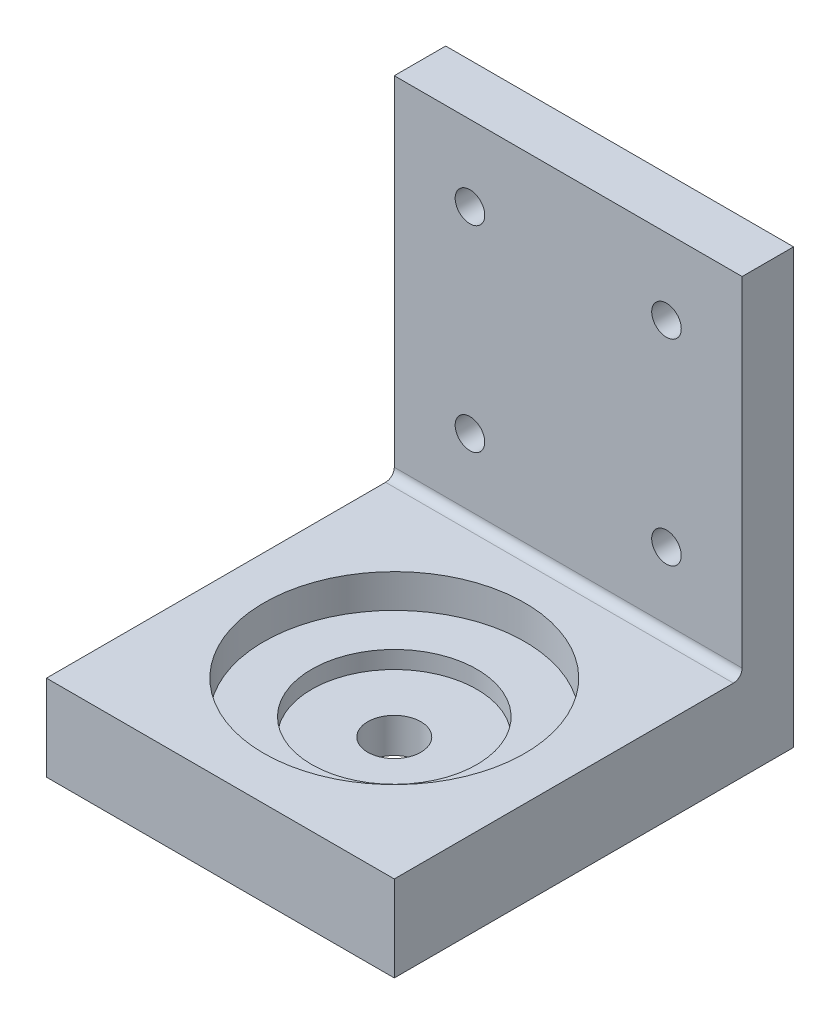
ISO-10303-21;
HEADER;
FILE_DESCRIPTION(('STEP AP214'),'2;1');
FILE_NAME('part.step','',(''),(''),'','','');
FILE_SCHEMA(('AUTOMOTIVE_DESIGN { 1 0 10303 214 1 1 1 1 }'));
ENDSEC;
DATA;
#1=APPLICATION_CONTEXT('core data for automotive mechanical design processes');
#2=APPLICATION_PROTOCOL_DEFINITION('international standard','automotive_design',2000,#1);
#3=PRODUCT_CONTEXT('',#1,'mechanical');
#4=PRODUCT('Part','Part','',(#3));
#5=PRODUCT_RELATED_PRODUCT_CATEGORY('part','',(#4));
#6=PRODUCT_DEFINITION_FORMATION('','',#4);
#7=PRODUCT_DEFINITION_CONTEXT('part definition',#1,'design');
#8=PRODUCT_DEFINITION('design','',#6,#7);
#9=PRODUCT_DEFINITION_SHAPE('','',#8);
#10=(LENGTH_UNIT() NAMED_UNIT(*) SI_UNIT(.MILLI.,.METRE.));
#11=(NAMED_UNIT(*) PLANE_ANGLE_UNIT() SI_UNIT($,.RADIAN.));
#12=(NAMED_UNIT(*) SI_UNIT($,.STERADIAN.) SOLID_ANGLE_UNIT());
#13=UNCERTAINTY_MEASURE_WITH_UNIT(LENGTH_MEASURE(1.E-05),#10,'distance_accuracy_value','');
#14=(GEOMETRIC_REPRESENTATION_CONTEXT(3) GLOBAL_UNCERTAINTY_ASSIGNED_CONTEXT((#13)) GLOBAL_UNIT_ASSIGNED_CONTEXT((#10,
#11,#12)) REPRESENTATION_CONTEXT('',''));
#15=CARTESIAN_POINT('',(0.,0.,0.));
#16=DIRECTION('',(0.,0.,1.));
#17=DIRECTION('',(1.,0.,0.));
#18=AXIS2_PLACEMENT_3D('',#15,#16,#17);
#19=CARTESIAN_POINT('',(0.,9.86484829732188,0.));
#20=DIRECTION('',(1.,0.,0.));
#21=DIRECTION('',(0.,0.,-1.));
#22=AXIS2_PLACEMENT_3D('',#19,#20,#21);
#23=PLANE('',#22);
#24=DIRECTION('',(0.,0.,1.));
#25=VECTOR('',#24,1.);
#26=CARTESIAN_POINT('',(0.,0.,0.));
#27=LINE('',#26,#25);
#28=CARTESIAN_POINT('',(0.,0.,-5.91350116383523));
#29=VERTEX_POINT('',#28);
#30=CARTESIAN_POINT('',(0.,0.,40.));
#31=VERTEX_POINT('',#30);
#32=EDGE_CURVE('E131',#29,#31,#27,.T.);
#33=ORIENTED_EDGE('',*,*,#32,.T.);
#34=DIRECTION('',(0.,-1.,0.));
#35=VECTOR('',#34,1.);
#36=CARTESIAN_POINT('',(0.,9.86484829732188,40.));
#37=LINE('',#36,#35);
#38=CARTESIAN_POINT('',(0.,9.86484829732188,40.));
#39=VERTEX_POINT('',#38);
#40=EDGE_CURVE('E152',#39,#31,#37,.T.);
#41=ORIENTED_EDGE('',*,*,#40,.F.);
#42=DIRECTION('',(0.,0.,1.));
#43=VECTOR('',#42,1.);
#44=CARTESIAN_POINT('',(0.,9.86484829732188,0.));
#45=LINE('',#44,#43);
#46=CARTESIAN_POINT('',(0.,9.86484829732188,1.));
#47=VERTEX_POINT('',#46);
#48=EDGE_CURVE('E139',#47,#39,#45,.T.);
#49=ORIENTED_EDGE('',*,*,#48,.F.);
#50=CARTESIAN_POINT('',(0.,10.8648482973219,1.));
#51=DIRECTION('',(1.,0.,0.));
#52=DIRECTION('',(0.,0.,-1.));
#53=AXIS2_PLACEMENT_3D('',#50,#51,#52);
#54=CIRCLE('',#53,1.);
#55=CARTESIAN_POINT('',(0.,10.8648482973219,0.));
#56=VERTEX_POINT('',#55);
#57=EDGE_CURVE('E50',#47,#56,#54,.T.);
#58=ORIENTED_EDGE('',*,*,#57,.T.);
#59=DIRECTION('',(0.,-1.,0.));
#60=VECTOR('',#59,1.);
#61=CARTESIAN_POINT('',(0.,49.86,0.));
#62=LINE('',#61,#60);
#63=CARTESIAN_POINT('',(0.,49.86,0.));
#64=VERTEX_POINT('',#63);
#65=EDGE_CURVE('E96',#64,#56,#62,.T.);
#66=ORIENTED_EDGE('',*,*,#65,.F.);
#67=DIRECTION('',(0.,0.,1.));
#68=VECTOR('',#67,1.);
#69=CARTESIAN_POINT('',(0.,49.86,0.));
#70=LINE('',#69,#68);
#71=CARTESIAN_POINT('',(0.,49.86,-5.91350116383523));
#72=VERTEX_POINT('',#71);
#73=EDGE_CURVE('E101',#72,#64,#70,.T.);
#74=ORIENTED_EDGE('',*,*,#73,.F.);
#75=DIRECTION('',(0.,-1.,0.));
#76=VECTOR('',#75,1.);
#77=CARTESIAN_POINT('',(0.,49.86,-5.91350116383523));
#78=LINE('',#77,#76);
#79=EDGE_CURVE('E269',#72,#29,#78,.T.);
#80=ORIENTED_EDGE('',*,*,#79,.T.);
#81=EDGE_LOOP('',(#33,#41,#49,#58,#66,#74,#80));
#82=FACE_BOUND('',#81,.T.);
#83=ADVANCED_FACE('F39',(#82),#23,.F.);
#84=CARTESIAN_POINT('',(0.,9.86484829732188,40.));
#85=DIRECTION('',(0.,0.,-1.));
#86=DIRECTION('',(-1.,0.,0.));
#87=AXIS2_PLACEMENT_3D('',#84,#85,#86);
#88=PLANE('',#87);
#89=DIRECTION('',(1.,0.,0.));
#90=VECTOR('',#89,1.);
#91=CARTESIAN_POINT('',(0.,0.,40.));
#92=LINE('',#91,#90);
#93=CARTESIAN_POINT('',(40.,0.,40.));
#94=VERTEX_POINT('',#93);
#95=EDGE_CURVE('E149',#31,#94,#92,.T.);
#96=ORIENTED_EDGE('',*,*,#95,.T.);
#97=DIRECTION('',(0.,-1.,0.));
#98=VECTOR('',#97,1.);
#99=CARTESIAN_POINT('',(40.,9.86484829732188,40.));
#100=LINE('',#99,#98);
#101=CARTESIAN_POINT('',(40.,9.86484829732188,40.));
#102=VERTEX_POINT('',#101);
#103=EDGE_CURVE('E147',#102,#94,#100,.T.);
#104=ORIENTED_EDGE('',*,*,#103,.F.);
#105=DIRECTION('',(1.,0.,0.));
#106=VECTOR('',#105,1.);
#107=CARTESIAN_POINT('',(0.,9.86484829732188,40.));
#108=LINE('',#107,#106);
#109=EDGE_CURVE('E138',#39,#102,#108,.T.);
#110=ORIENTED_EDGE('',*,*,#109,.F.);
#111=ORIENTED_EDGE('',*,*,#40,.T.);
#112=EDGE_LOOP('',(#96,#104,#110,#111));
#113=FACE_BOUND('',#112,.T.);
#114=ADVANCED_FACE('F166',(#113),#88,.F.);
#115=CARTESIAN_POINT('',(40.,9.86484829732188,0.));
#116=DIRECTION('',(-1.,0.,0.));
#117=DIRECTION('',(0.,0.,1.));
#118=AXIS2_PLACEMENT_3D('',#115,#116,#117);
#119=PLANE('',#118);
#120=DIRECTION('',(0.,0.,-1.));
#121=VECTOR('',#120,1.);
#122=CARTESIAN_POINT('',(40.,0.,0.));
#123=LINE('',#122,#121);
#124=CARTESIAN_POINT('',(40.,0.,-5.91350116383523));
#125=VERTEX_POINT('',#124);
#126=EDGE_CURVE('E142',#94,#125,#123,.T.);
#127=ORIENTED_EDGE('',*,*,#126,.T.);
#128=DIRECTION('',(0.,-1.,0.));
#129=VECTOR('',#128,1.);
#130=CARTESIAN_POINT('',(40.,49.86,-5.91350116383523));
#131=LINE('',#130,#129);
#132=CARTESIAN_POINT('',(40.,49.86,-5.91350116383523));
#133=VERTEX_POINT('',#132);
#134=EDGE_CURVE('E118',#133,#125,#131,.T.);
#135=ORIENTED_EDGE('',*,*,#134,.F.);
#136=DIRECTION('',(0.,0.,-1.));
#137=VECTOR('',#136,1.);
#138=CARTESIAN_POINT('',(40.,49.86,0.));
#139=LINE('',#138,#137);
#140=CARTESIAN_POINT('',(40.,49.86,0.));
#141=VERTEX_POINT('',#140);
#142=EDGE_CURVE('E105',#141,#133,#139,.T.);
#143=ORIENTED_EDGE('',*,*,#142,.F.);
#144=DIRECTION('',(0.,-1.,0.));
#145=VECTOR('',#144,1.);
#146=CARTESIAN_POINT('',(40.,49.86,0.));
#147=LINE('',#146,#145);
#148=CARTESIAN_POINT('',(40.,10.8648482973219,0.));
#149=VERTEX_POINT('',#148);
#150=EDGE_CURVE('E100',#141,#149,#147,.T.);
#151=ORIENTED_EDGE('',*,*,#150,.T.);
#152=CARTESIAN_POINT('',(40.,10.8648482973219,1.));
#153=DIRECTION('',(-1.,0.,0.));
#154=DIRECTION('',(0.,0.,1.));
#155=AXIS2_PLACEMENT_3D('',#152,#153,#154);
#156=CIRCLE('',#155,1.);
#157=CARTESIAN_POINT('',(40.,9.86484829732188,1.));
#158=VERTEX_POINT('',#157);
#159=EDGE_CURVE('E11',#149,#158,#156,.T.);
#160=ORIENTED_EDGE('',*,*,#159,.T.);
#161=DIRECTION('',(0.,0.,-1.));
#162=VECTOR('',#161,1.);
#163=CARTESIAN_POINT('',(40.,9.86484829732188,0.));
#164=LINE('',#163,#162);
#165=EDGE_CURVE('E141',#102,#158,#164,.T.);
#166=ORIENTED_EDGE('',*,*,#165,.F.);
#167=ORIENTED_EDGE('',*,*,#103,.T.);
#168=EDGE_LOOP('',(#127,#135,#143,#151,#160,#166,#167));
#169=FACE_BOUND('',#168,.T.);
#170=ADVANCED_FACE('F175',(#169),#119,.F.);
#171=CARTESIAN_POINT('',(0.,9.86484829732188,0.));
#172=DIRECTION('',(0.,1.,0.));
#173=DIRECTION('',(0.,0.,1.));
#174=AXIS2_PLACEMENT_3D('',#171,#172,#173);
#175=PLANE('',#174);
#176=CARTESIAN_POINT('',(20.,9.86484829732188,20.));
#177=DIRECTION('',(0.,1.,0.));
#178=DIRECTION('',(0.,0.,1.));
#179=AXIS2_PLACEMENT_3D('',#176,#177,#178);
#180=CIRCLE('',#179,15.);
#181=CARTESIAN_POINT('',(20.,9.86484829732188,35.));
#182=VERTEX_POINT('',#181);
#183=EDGE_CURVE('E126',#182,#182,#180,.T.);
#184=ORIENTED_EDGE('',*,*,#183,.F.);
#185=EDGE_LOOP('',(#184));
#186=FACE_BOUND('',#185,.T.);
#187=ORIENTED_EDGE('',*,*,#165,.T.);
#188=DIRECTION('',(-1.,0.,0.));
#189=VECTOR('',#188,1.);
#190=CARTESIAN_POINT('',(0.,9.86484829732188,1.));
#191=LINE('',#190,#189);
#192=EDGE_CURVE('E157',#158,#47,#191,.T.);
#193=ORIENTED_EDGE('',*,*,#192,.T.);
#194=ORIENTED_EDGE('',*,*,#48,.T.);
#195=ORIENTED_EDGE('',*,*,#109,.T.);
#196=EDGE_LOOP('',(#187,#193,#194,#195));
#197=FACE_BOUND('',#196,.T.);
#198=ADVANCED_FACE('F163',(#186,#197),#175,.T.);
#199=CARTESIAN_POINT('',(0.,0.,0.));
#200=DIRECTION('',(0.,1.,0.));
#201=DIRECTION('',(0.,0.,1.));
#202=AXIS2_PLACEMENT_3D('',#199,#200,#201);
#203=PLANE('',#202);
#204=CARTESIAN_POINT('',(20.,0.,20.));
#205=DIRECTION('',(0.,1.,0.));
#206=DIRECTION('',(0.,0.,1.));
#207=AXIS2_PLACEMENT_3D('',#204,#205,#206);
#208=CIRCLE('',#207,3.05);
#209=CARTESIAN_POINT('',(20.,0.,23.05));
#210=VERTEX_POINT('',#209);
#211=EDGE_CURVE('E120',#210,#210,#208,.T.);
#212=ORIENTED_EDGE('',*,*,#211,.T.);
#213=EDGE_LOOP('',(#212));
#214=FACE_BOUND('',#213,.T.);
#215=ORIENTED_EDGE('',*,*,#32,.F.);
#216=DIRECTION('',(-1.,0.,0.));
#217=VECTOR('',#216,1.);
#218=CARTESIAN_POINT('',(0.,0.,-5.91350116383523));
#219=LINE('',#218,#217);
#220=EDGE_CURVE('E111',#125,#29,#219,.T.);
#221=ORIENTED_EDGE('',*,*,#220,.F.);
#222=ORIENTED_EDGE('',*,*,#126,.F.);
#223=ORIENTED_EDGE('',*,*,#95,.F.);
#224=EDGE_LOOP('',(#215,#221,#222,#223));
#225=FACE_BOUND('',#224,.T.);
#226=ADVANCED_FACE('F188',(#214,#225),#203,.F.);
#227=CARTESIAN_POINT('',(20.,6.00484829732188,20.));
#228=DIRECTION('',(0.,1.,0.));
#229=DIRECTION('',(0.,0.,1.));
#230=AXIS2_PLACEMENT_3D('',#227,#228,#229);
#231=CYLINDRICAL_SURFACE('',#230,15.);
#232=CARTESIAN_POINT('',(20.,6.00484829732188,20.));
#233=DIRECTION('',(0.,1.,0.));
#234=DIRECTION('',(0.,0.,1.));
#235=AXIS2_PLACEMENT_3D('',#232,#233,#234);
#236=CIRCLE('',#235,15.);
#237=CARTESIAN_POINT('',(20.,6.00484829732188,35.));
#238=VERTEX_POINT('',#237);
#239=EDGE_CURVE('E134',#238,#238,#236,.T.);
#240=ORIENTED_EDGE('',*,*,#239,.F.);
#241=EDGE_LOOP('',(#240));
#242=FACE_BOUND('',#241,.T.);
#243=ORIENTED_EDGE('',*,*,#183,.T.);
#244=EDGE_LOOP('',(#243));
#245=FACE_BOUND('',#244,.T.);
#246=ADVANCED_FACE('F194',(#242,#245),#231,.F.);
#247=CARTESIAN_POINT('',(20.,6.00484829732188,20.));
#248=DIRECTION('',(0.,1.,0.));
#249=DIRECTION('',(0.,0.,1.));
#250=AXIS2_PLACEMENT_3D('',#247,#248,#249);
#251=PLANE('',#250);
#252=CARTESIAN_POINT('',(20.,6.00484829732188,20.));
#253=DIRECTION('',(0.,1.,0.));
#254=DIRECTION('',(0.,0.,1.));
#255=AXIS2_PLACEMENT_3D('',#252,#253,#254);
#256=CIRCLE('',#255,9.5);
#257=CARTESIAN_POINT('',(20.,6.00484829732188,29.5));
#258=VERTEX_POINT('',#257);
#259=EDGE_CURVE('E121',#258,#258,#256,.T.);
#260=ORIENTED_EDGE('',*,*,#259,.F.);
#261=EDGE_LOOP('',(#260));
#262=FACE_BOUND('',#261,.T.);
#263=ORIENTED_EDGE('',*,*,#239,.T.);
#264=EDGE_LOOP('',(#263));
#265=FACE_BOUND('',#264,.T.);
#266=ADVANCED_FACE('F196',(#262,#265),#251,.T.);
#267=CARTESIAN_POINT('',(20.,4.00484829732188,20.));
#268=DIRECTION('',(0.,1.,0.));
#269=DIRECTION('',(0.,0.,1.));
#270=AXIS2_PLACEMENT_3D('',#267,#268,#269);
#271=CYLINDRICAL_SURFACE('',#270,9.5);
#272=CARTESIAN_POINT('',(20.,4.00484829732188,20.));
#273=DIRECTION('',(0.,1.,0.));
#274=DIRECTION('',(0.,0.,1.));
#275=AXIS2_PLACEMENT_3D('',#272,#273,#274);
#276=CIRCLE('',#275,9.5);
#277=CARTESIAN_POINT('',(20.,4.00484829732188,29.5));
#278=VERTEX_POINT('',#277);
#279=EDGE_CURVE('E127',#278,#278,#276,.T.);
#280=ORIENTED_EDGE('',*,*,#279,.F.);
#281=EDGE_LOOP('',(#280));
#282=FACE_BOUND('',#281,.T.);
#283=ORIENTED_EDGE('',*,*,#259,.T.);
#284=EDGE_LOOP('',(#283));
#285=FACE_BOUND('',#284,.T.);
#286=ADVANCED_FACE('F201',(#282,#285),#271,.F.);
#287=CARTESIAN_POINT('',(20.,4.00484829732188,20.));
#288=DIRECTION('',(0.,1.,0.));
#289=DIRECTION('',(0.,0.,1.));
#290=AXIS2_PLACEMENT_3D('',#287,#288,#289);
#291=PLANE('',#290);
#292=CARTESIAN_POINT('',(20.,4.00484829732188,20.));
#293=DIRECTION('',(0.,1.,0.));
#294=DIRECTION('',(0.,0.,1.));
#295=AXIS2_PLACEMENT_3D('',#292,#293,#294);
#296=CIRCLE('',#295,3.05);
#297=CARTESIAN_POINT('',(20.,4.00484829732188,23.05));
#298=VERTEX_POINT('',#297);
#299=EDGE_CURVE('E112',#298,#298,#296,.T.);
#300=ORIENTED_EDGE('',*,*,#299,.F.);
#301=EDGE_LOOP('',(#300));
#302=FACE_BOUND('',#301,.T.);
#303=ORIENTED_EDGE('',*,*,#279,.T.);
#304=EDGE_LOOP('',(#303));
#305=FACE_BOUND('',#304,.T.);
#306=ADVANCED_FACE('F206',(#302,#305),#291,.T.);
#307=CARTESIAN_POINT('',(20.,0.,20.));
#308=DIRECTION('',(0.,1.,0.));
#309=DIRECTION('',(0.,0.,1.));
#310=AXIS2_PLACEMENT_3D('',#307,#308,#309);
#311=CYLINDRICAL_SURFACE('',#310,3.05);
#312=ORIENTED_EDGE('',*,*,#211,.F.);
#313=EDGE_LOOP('',(#312));
#314=FACE_BOUND('',#313,.T.);
#315=ORIENTED_EDGE('',*,*,#299,.T.);
#316=EDGE_LOOP('',(#315));
#317=FACE_BOUND('',#316,.T.);
#318=ADVANCED_FACE('F215',(#314,#317),#311,.F.);
#319=CARTESIAN_POINT('',(0.,49.86,0.));
#320=DIRECTION('',(0.,0.,-1.));
#321=DIRECTION('',(-1.,0.,0.));
#322=AXIS2_PLACEMENT_3D('',#319,#320,#321);
#323=PLANE('',#322);
#324=CARTESIAN_POINT('',(8.7,41.16,0.));
#325=DIRECTION('',(0.,0.,1.));
#326=DIRECTION('',(1.,0.,0.));
#327=AXIS2_PLACEMENT_3D('',#324,#325,#326);
#328=CIRCLE('',#327,1.7);
#329=CARTESIAN_POINT('',(10.4,41.16,0.));
#330=VERTEX_POINT('',#329);
#331=EDGE_CURVE('E259',#330,#330,#328,.T.);
#332=ORIENTED_EDGE('',*,*,#331,.F.);
#333=EDGE_LOOP('',(#332));
#334=FACE_BOUND('',#333,.T.);
#335=CARTESIAN_POINT('',(31.3,41.16,0.));
#336=DIRECTION('',(0.,0.,1.));
#337=DIRECTION('',(1.,0.,0.));
#338=AXIS2_PLACEMENT_3D('',#335,#336,#337);
#339=CIRCLE('',#338,1.7);
#340=CARTESIAN_POINT('',(33.,41.16,0.));
#341=VERTEX_POINT('',#340);
#342=EDGE_CURVE('E249',#341,#341,#339,.T.);
#343=ORIENTED_EDGE('',*,*,#342,.F.);
#344=EDGE_LOOP('',(#343));
#345=FACE_BOUND('',#344,.T.);
#346=CARTESIAN_POINT('',(31.3,18.5648482973219,0.));
#347=DIRECTION('',(0.,0.,1.));
#348=DIRECTION('',(1.,0.,0.));
#349=AXIS2_PLACEMENT_3D('',#346,#347,#348);
#350=CIRCLE('',#349,1.7);
#351=CARTESIAN_POINT('',(33.,18.5648482973219,0.));
#352=VERTEX_POINT('',#351);
#353=EDGE_CURVE('E243',#352,#352,#350,.T.);
#354=ORIENTED_EDGE('',*,*,#353,.F.);
#355=EDGE_LOOP('',(#354));
#356=FACE_BOUND('',#355,.T.);
#357=CARTESIAN_POINT('',(8.7,18.5648482973219,0.));
#358=DIRECTION('',(0.,0.,1.));
#359=DIRECTION('',(1.,0.,0.));
#360=AXIS2_PLACEMENT_3D('',#357,#358,#359);
#361=CIRCLE('',#360,1.7);
#362=CARTESIAN_POINT('',(10.4,18.5648482973219,0.));
#363=VERTEX_POINT('',#362);
#364=EDGE_CURVE('E244',#363,#363,#361,.T.);
#365=ORIENTED_EDGE('',*,*,#364,.F.);
#366=EDGE_LOOP('',(#365));
#367=FACE_BOUND('',#366,.T.);
#368=ORIENTED_EDGE('',*,*,#65,.T.);
#369=DIRECTION('',(-1.,0.,0.));
#370=VECTOR('',#369,1.);
#371=CARTESIAN_POINT('',(0.,10.8648482973219,0.));
#372=LINE('',#371,#370);
#373=EDGE_CURVE('E58',#56,#149,#372,.F.);
#374=ORIENTED_EDGE('',*,*,#373,.T.);
#375=ORIENTED_EDGE('',*,*,#150,.F.);
#376=DIRECTION('',(1.,0.,0.));
#377=VECTOR('',#376,1.);
#378=CARTESIAN_POINT('',(0.,49.86,0.));
#379=LINE('',#378,#377);
#380=EDGE_CURVE('E93',#64,#141,#379,.T.);
#381=ORIENTED_EDGE('',*,*,#380,.F.);
#382=EDGE_LOOP('',(#368,#374,#375,#381));
#383=FACE_BOUND('',#382,.T.);
#384=ADVANCED_FACE('F97',(#334,#345,#356,#367,#383),#323,.F.);
#385=CARTESIAN_POINT('',(0.,49.86,-5.91350116383523));
#386=DIRECTION('',(0.,0.,1.));
#387=DIRECTION('',(1.,0.,0.));
#388=AXIS2_PLACEMENT_3D('',#385,#386,#387);
#389=PLANE('',#388);
#390=CARTESIAN_POINT('',(8.7,41.16,-5.91350116383523));
#391=DIRECTION('',(0.,0.,1.));
#392=DIRECTION('',(1.,0.,0.));
#393=AXIS2_PLACEMENT_3D('',#390,#391,#392);
#394=CIRCLE('',#393,1.7);
#395=CARTESIAN_POINT('',(10.4,41.16,-5.91350116383523));
#396=VERTEX_POINT('',#395);
#397=EDGE_CURVE('E263',#396,#396,#394,.T.);
#398=ORIENTED_EDGE('',*,*,#397,.T.);
#399=EDGE_LOOP('',(#398));
#400=FACE_BOUND('',#399,.T.);
#401=CARTESIAN_POINT('',(31.3,41.16,-5.91350116383523));
#402=DIRECTION('',(0.,0.,1.));
#403=DIRECTION('',(1.,0.,0.));
#404=AXIS2_PLACEMENT_3D('',#401,#402,#403);
#405=CIRCLE('',#404,1.7);
#406=CARTESIAN_POINT('',(33.,41.16,-5.91350116383523));
#407=VERTEX_POINT('',#406);
#408=EDGE_CURVE('E253',#407,#407,#405,.T.);
#409=ORIENTED_EDGE('',*,*,#408,.T.);
#410=EDGE_LOOP('',(#409));
#411=FACE_BOUND('',#410,.T.);
#412=CARTESIAN_POINT('',(31.3,18.5648482973219,-5.91350116383523));
#413=DIRECTION('',(0.,0.,1.));
#414=DIRECTION('',(1.,0.,0.));
#415=AXIS2_PLACEMENT_3D('',#412,#413,#414);
#416=CIRCLE('',#415,1.7);
#417=CARTESIAN_POINT('',(33.,18.5648482973219,-5.91350116383523));
#418=VERTEX_POINT('',#417);
#419=EDGE_CURVE('E239',#418,#418,#416,.T.);
#420=ORIENTED_EDGE('',*,*,#419,.T.);
#421=EDGE_LOOP('',(#420));
#422=FACE_BOUND('',#421,.T.);
#423=CARTESIAN_POINT('',(8.7,18.5648482973219,-5.91350116383523));
#424=DIRECTION('',(0.,0.,1.));
#425=DIRECTION('',(1.,0.,0.));
#426=AXIS2_PLACEMENT_3D('',#423,#424,#425);
#427=CIRCLE('',#426,1.7);
#428=CARTESIAN_POINT('',(10.4,18.5648482973219,-5.91350116383523));
#429=VERTEX_POINT('',#428);
#430=EDGE_CURVE('E247',#429,#429,#427,.T.);
#431=ORIENTED_EDGE('',*,*,#430,.T.);
#432=EDGE_LOOP('',(#431));
#433=FACE_BOUND('',#432,.T.);
#434=ORIENTED_EDGE('',*,*,#220,.T.);
#435=ORIENTED_EDGE('',*,*,#79,.F.);
#436=DIRECTION('',(-1.,0.,0.));
#437=VECTOR('',#436,1.);
#438=CARTESIAN_POINT('',(0.,49.86,-5.91350116383523));
#439=LINE('',#438,#437);
#440=EDGE_CURVE('E108',#133,#72,#439,.T.);
#441=ORIENTED_EDGE('',*,*,#440,.F.);
#442=ORIENTED_EDGE('',*,*,#134,.T.);
#443=EDGE_LOOP('',(#434,#435,#441,#442));
#444=FACE_BOUND('',#443,.T.);
#445=ADVANCED_FACE('F217',(#400,#411,#422,#433,#444),#389,.F.);
#446=CARTESIAN_POINT('',(0.,49.86,0.));
#447=DIRECTION('',(0.,-1.,0.));
#448=DIRECTION('',(0.,0.,-1.));
#449=AXIS2_PLACEMENT_3D('',#446,#447,#448);
#450=PLANE('',#449);
#451=ORIENTED_EDGE('',*,*,#73,.T.);
#452=ORIENTED_EDGE('',*,*,#380,.T.);
#453=ORIENTED_EDGE('',*,*,#142,.T.);
#454=ORIENTED_EDGE('',*,*,#440,.T.);
#455=EDGE_LOOP('',(#451,#452,#453,#454));
#456=FACE_BOUND('',#455,.T.);
#457=ADVANCED_FACE('F106',(#456),#450,.F.);
#458=CARTESIAN_POINT('',(8.7,18.5648482973219,-5.91350116383523));
#459=DIRECTION('',(0.,0.,1.));
#460=DIRECTION('',(1.,0.,0.));
#461=AXIS2_PLACEMENT_3D('',#458,#459,#460);
#462=CYLINDRICAL_SURFACE('',#461,1.7);
#463=CARTESIAN_POINT('',(10.4,18.5648482973219,-5.91350116383523));
#464=CARTESIAN_POINT('',(10.4,18.5648482973219,-5.85190219337861));
#465=CARTESIAN_POINT('',(10.4,18.5648482973219,-5.790303222922));
#466=CARTESIAN_POINT('',(10.4,18.5648482973219,-5.66710528200876));
#467=CARTESIAN_POINT('',(10.4,18.5648482973219,-5.60550631155215));
#468=CARTESIAN_POINT('',(10.4,18.5648482973219,-5.48230837063891));
#469=CARTESIAN_POINT('',(10.4,18.5648482973219,-5.42070940018229));
#470=CARTESIAN_POINT('',(10.4,18.5648482973219,-5.29751145926906));
#471=CARTESIAN_POINT('',(10.4,18.5648482973219,-5.23591248881244));
#472=CARTESIAN_POINT('',(10.4,18.5648482973219,-5.11271454789921));
#473=CARTESIAN_POINT('',(10.4,18.5648482973219,-5.05111557744259));
#474=CARTESIAN_POINT('',(10.4,18.5648482973219,-4.92791763652936));
#475=CARTESIAN_POINT('',(10.4,18.5648482973219,-4.86631866607274));
#476=CARTESIAN_POINT('',(10.4,18.5648482973219,-4.74312072515951));
#477=CARTESIAN_POINT('',(10.4,18.5648482973219,-4.68152175470289));
#478=CARTESIAN_POINT('',(10.4,18.5648482973219,-4.55832381378966));
#479=CARTESIAN_POINT('',(10.4,18.5648482973219,-4.49672484333304));
#480=CARTESIAN_POINT('',(10.4,18.5648482973219,-4.37352690241981));
#481=CARTESIAN_POINT('',(10.4,18.5648482973219,-4.31192793196319));
#482=CARTESIAN_POINT('',(10.4,18.5648482973219,-4.18872999104995));
#483=CARTESIAN_POINT('',(10.4,18.5648482973219,-4.12713102059334));
#484=CARTESIAN_POINT('',(10.4,18.5648482973219,-4.0039330796801));
#485=CARTESIAN_POINT('',(10.4,18.5648482973219,-3.94233410922349));
#486=CARTESIAN_POINT('',(10.4,18.5648482973219,-3.81913616831025));
#487=CARTESIAN_POINT('',(10.4,18.5648482973219,-3.75753719785364));
#488=CARTESIAN_POINT('',(10.4,18.5648482973219,-3.6343392569404));
#489=CARTESIAN_POINT('',(10.4,18.5648482973219,-3.57274028648378));
#490=CARTESIAN_POINT('',(10.4,18.5648482973219,-3.44954234557055));
#491=CARTESIAN_POINT('',(10.4,18.5648482973219,-3.38794337511393));
#492=CARTESIAN_POINT('',(10.4,18.5648482973219,-3.2647454342007));
#493=CARTESIAN_POINT('',(10.4,18.5648482973219,-3.20314646374408));
#494=CARTESIAN_POINT('',(10.4,18.5648482973219,-3.07994852283085));
#495=CARTESIAN_POINT('',(10.4,18.5648482973219,-3.01834955237423));
#496=CARTESIAN_POINT('',(10.4,18.5648482973219,-2.895151611461));
#497=CARTESIAN_POINT('',(10.4,18.5648482973219,-2.83355264100438));
#498=CARTESIAN_POINT('',(10.4,18.5648482973219,-2.71035470009115));
#499=CARTESIAN_POINT('',(10.4,18.5648482973219,-2.64875572963453));
#500=CARTESIAN_POINT('',(10.4,18.5648482973219,-2.5255577887213));
#501=CARTESIAN_POINT('',(10.4,18.5648482973219,-2.46395881826468));
#502=CARTESIAN_POINT('',(10.4,18.5648482973219,-2.34076087735145));
#503=CARTESIAN_POINT('',(10.4,18.5648482973219,-2.27916190689483));
#504=CARTESIAN_POINT('',(10.4,18.5648482973219,-2.15596396598159));
#505=CARTESIAN_POINT('',(10.4,18.5648482973219,-2.09436499552498));
#506=CARTESIAN_POINT('',(10.4,18.5648482973219,-1.97116705461174));
#507=CARTESIAN_POINT('',(10.4,18.5648482973219,-1.90956808415513));
#508=CARTESIAN_POINT('',(10.4,18.5648482973219,-1.78637014324189));
#509=CARTESIAN_POINT('',(10.4,18.5648482973219,-1.72477117278528));
#510=CARTESIAN_POINT('',(10.4,18.5648482973219,-1.60157323187204));
#511=CARTESIAN_POINT('',(10.4,18.5648482973219,-1.53997426141542));
#512=CARTESIAN_POINT('',(10.4,18.5648482973219,-1.41677632050219));
#513=CARTESIAN_POINT('',(10.4,18.5648482973219,-1.35517735004557));
#514=CARTESIAN_POINT('',(10.4,18.5648482973219,-1.23197940913234));
#515=CARTESIAN_POINT('',(10.4,18.5648482973219,-1.17038043867572));
#516=CARTESIAN_POINT('',(10.4,18.5648482973219,-1.04718249776249));
#517=CARTESIAN_POINT('',(10.4,18.5648482973219,-0.985583527305871));
#518=CARTESIAN_POINT('',(10.4,18.5648482973219,-0.862385586392638));
#519=CARTESIAN_POINT('',(10.4,18.5648482973219,-0.800786615936021));
#520=CARTESIAN_POINT('',(10.4,18.5648482973219,-0.677588675022787));
#521=CARTESIAN_POINT('',(10.4,18.5648482973219,-0.61598970456617));
#522=CARTESIAN_POINT('',(10.4,18.5648482973219,-0.492791763652936));
#523=CARTESIAN_POINT('',(10.4,18.5648482973219,-0.431192793196319));
#524=CARTESIAN_POINT('',(10.4,18.5648482973219,-0.307994852283085));
#525=CARTESIAN_POINT('',(10.4,18.5648482973219,-0.246395881826468));
#526=CARTESIAN_POINT('',(10.4,18.5648482973219,-0.123197940913234));
#527=CARTESIAN_POINT('',(10.4,18.5648482973219,-0.0615989704566171));
#528=CARTESIAN_POINT('',(10.4,18.5648482973219,0.));
#529=B_SPLINE_CURVE_WITH_KNOTS('',3,(#463,#464,#465,#466,#467,#468,#469,#470,#471,#472,#473,
#474,#475,#476,#477,#478,#479,#480,#481,#482,#483,#484,#485,#486,#487,#488,#489,#490,#491,#492,
#493,#494,#495,#496,#497,#498,#499,#500,#501,#502,#503,#504,#505,#506,#507,#508,#509,#510,#511,
#512,#513,#514,#515,#516,#517,#518,#519,#520,#521,#522,#523,#524,#525,#526,#527,#528),
.UNSPECIFIED.,.F.,.F.,(4,2,2,2,2,2,2,2,2,2,2,2,2,2,2,2,2,2,2,2,2,2,2,2,2,2,2,2,2,2,2,2,4),(0.,
0.18479691136985,0.369593822739702,0.554390734109552,0.739187645479403,0.923984556849254,
1.1087814682191,1.29357837958896,1.47837529095881,1.66317220232866,1.84796911369851,
2.03276602506836,2.21756293643821,2.40235984780806,2.58715675917791,2.77195367054776,
2.95675058191761,3.14154749328746,3.32634440465732,3.51114131602717,3.69593822739702,
3.88073513876687,4.06553205013672,4.25032896150657,4.43512587287642,4.61992278424627,
4.80471969561612,4.98951660698597,5.17431351835583,5.35911042972568,5.54390734109553,
5.72870425246538,5.91350116383523),.UNSPECIFIED.);
#530=EDGE_CURVE('BSEAM223',#429,#363,#529,.T.);
#531=ORIENTED_EDGE('',*,*,#430,.F.);
#532=ORIENTED_EDGE('',*,*,#364,.T.);
#533=ORIENTED_EDGE('',*,*,#530,.T.);
#534=ORIENTED_EDGE('',*,*,#530,.F.);
#535=EDGE_LOOP('',(#531,#533,#532,#534));
#536=FACE_BOUND('',#535,.T.);
#537=ADVANCED_FACE('F223',(#536),#462,.F.);
#538=CARTESIAN_POINT('',(31.3,18.5648482973219,-5.91350116383523));
#539=DIRECTION('',(0.,0.,1.));
#540=DIRECTION('',(1.,0.,0.));
#541=AXIS2_PLACEMENT_3D('',#538,#539,#540);
#542=CYLINDRICAL_SURFACE('',#541,1.7);
#543=CARTESIAN_POINT('',(33.,18.5648482973219,-5.91350116383523));
#544=CARTESIAN_POINT('',(33.,18.5648482973219,-5.85190219337861));
#545=CARTESIAN_POINT('',(33.,18.5648482973219,-5.790303222922));
#546=CARTESIAN_POINT('',(33.,18.5648482973219,-5.66710528200876));
#547=CARTESIAN_POINT('',(33.,18.5648482973219,-5.60550631155215));
#548=CARTESIAN_POINT('',(33.,18.5648482973219,-5.48230837063891));
#549=CARTESIAN_POINT('',(33.,18.5648482973219,-5.42070940018229));
#550=CARTESIAN_POINT('',(33.,18.5648482973219,-5.29751145926906));
#551=CARTESIAN_POINT('',(33.,18.5648482973219,-5.23591248881244));
#552=CARTESIAN_POINT('',(33.,18.5648482973219,-5.11271454789921));
#553=CARTESIAN_POINT('',(33.,18.5648482973219,-5.05111557744259));
#554=CARTESIAN_POINT('',(33.,18.5648482973219,-4.92791763652936));
#555=CARTESIAN_POINT('',(33.,18.5648482973219,-4.86631866607274));
#556=CARTESIAN_POINT('',(33.,18.5648482973219,-4.74312072515951));
#557=CARTESIAN_POINT('',(33.,18.5648482973219,-4.68152175470289));
#558=CARTESIAN_POINT('',(33.,18.5648482973219,-4.55832381378966));
#559=CARTESIAN_POINT('',(33.,18.5648482973219,-4.49672484333304));
#560=CARTESIAN_POINT('',(33.,18.5648482973219,-4.37352690241981));
#561=CARTESIAN_POINT('',(33.,18.5648482973219,-4.31192793196319));
#562=CARTESIAN_POINT('',(33.,18.5648482973219,-4.18872999104995));
#563=CARTESIAN_POINT('',(33.,18.5648482973219,-4.12713102059334));
#564=CARTESIAN_POINT('',(33.,18.5648482973219,-4.0039330796801));
#565=CARTESIAN_POINT('',(33.,18.5648482973219,-3.94233410922349));
#566=CARTESIAN_POINT('',(33.,18.5648482973219,-3.81913616831025));
#567=CARTESIAN_POINT('',(33.,18.5648482973219,-3.75753719785364));
#568=CARTESIAN_POINT('',(33.,18.5648482973219,-3.6343392569404));
#569=CARTESIAN_POINT('',(33.,18.5648482973219,-3.57274028648378));
#570=CARTESIAN_POINT('',(33.,18.5648482973219,-3.44954234557055));
#571=CARTESIAN_POINT('',(33.,18.5648482973219,-3.38794337511393));
#572=CARTESIAN_POINT('',(33.,18.5648482973219,-3.2647454342007));
#573=CARTESIAN_POINT('',(33.,18.5648482973219,-3.20314646374408));
#574=CARTESIAN_POINT('',(33.,18.5648482973219,-3.07994852283085));
#575=CARTESIAN_POINT('',(33.,18.5648482973219,-3.01834955237423));
#576=CARTESIAN_POINT('',(33.,18.5648482973219,-2.895151611461));
#577=CARTESIAN_POINT('',(33.,18.5648482973219,-2.83355264100438));
#578=CARTESIAN_POINT('',(33.,18.5648482973219,-2.71035470009115));
#579=CARTESIAN_POINT('',(33.,18.5648482973219,-2.64875572963453));
#580=CARTESIAN_POINT('',(33.,18.5648482973219,-2.5255577887213));
#581=CARTESIAN_POINT('',(33.,18.5648482973219,-2.46395881826468));
#582=CARTESIAN_POINT('',(33.,18.5648482973219,-2.34076087735145));
#583=CARTESIAN_POINT('',(33.,18.5648482973219,-2.27916190689483));
#584=CARTESIAN_POINT('',(33.,18.5648482973219,-2.15596396598159));
#585=CARTESIAN_POINT('',(33.,18.5648482973219,-2.09436499552498));
#586=CARTESIAN_POINT('',(33.,18.5648482973219,-1.97116705461174));
#587=CARTESIAN_POINT('',(33.,18.5648482973219,-1.90956808415513));
#588=CARTESIAN_POINT('',(33.,18.5648482973219,-1.78637014324189));
#589=CARTESIAN_POINT('',(33.,18.5648482973219,-1.72477117278528));
#590=CARTESIAN_POINT('',(33.,18.5648482973219,-1.60157323187204));
#591=CARTESIAN_POINT('',(33.,18.5648482973219,-1.53997426141542));
#592=CARTESIAN_POINT('',(33.,18.5648482973219,-1.41677632050219));
#593=CARTESIAN_POINT('',(33.,18.5648482973219,-1.35517735004557));
#594=CARTESIAN_POINT('',(33.,18.5648482973219,-1.23197940913234));
#595=CARTESIAN_POINT('',(33.,18.5648482973219,-1.17038043867572));
#596=CARTESIAN_POINT('',(33.,18.5648482973219,-1.04718249776249));
#597=CARTESIAN_POINT('',(33.,18.5648482973219,-0.985583527305871));
#598=CARTESIAN_POINT('',(33.,18.5648482973219,-0.862385586392638));
#599=CARTESIAN_POINT('',(33.,18.5648482973219,-0.800786615936021));
#600=CARTESIAN_POINT('',(33.,18.5648482973219,-0.677588675022787));
#601=CARTESIAN_POINT('',(33.,18.5648482973219,-0.61598970456617));
#602=CARTESIAN_POINT('',(33.,18.5648482973219,-0.492791763652936));
#603=CARTESIAN_POINT('',(33.,18.5648482973219,-0.431192793196319));
#604=CARTESIAN_POINT('',(33.,18.5648482973219,-0.307994852283085));
#605=CARTESIAN_POINT('',(33.,18.5648482973219,-0.246395881826468));
#606=CARTESIAN_POINT('',(33.,18.5648482973219,-0.123197940913234));
#607=CARTESIAN_POINT('',(33.,18.5648482973219,-0.0615989704566171));
#608=CARTESIAN_POINT('',(33.,18.5648482973219,0.));
#609=B_SPLINE_CURVE_WITH_KNOTS('',3,(#543,#544,#545,#546,#547,#548,#549,#550,#551,#552,#553,
#554,#555,#556,#557,#558,#559,#560,#561,#562,#563,#564,#565,#566,#567,#568,#569,#570,#571,#572,
#573,#574,#575,#576,#577,#578,#579,#580,#581,#582,#583,#584,#585,#586,#587,#588,#589,#590,#591,
#592,#593,#594,#595,#596,#597,#598,#599,#600,#601,#602,#603,#604,#605,#606,#607,#608),
.UNSPECIFIED.,.F.,.F.,(4,2,2,2,2,2,2,2,2,2,2,2,2,2,2,2,2,2,2,2,2,2,2,2,2,2,2,2,2,2,2,2,4),(0.,
0.18479691136985,0.369593822739702,0.554390734109552,0.739187645479403,0.923984556849254,
1.1087814682191,1.29357837958896,1.47837529095881,1.66317220232866,1.84796911369851,
2.03276602506836,2.21756293643821,2.40235984780806,2.58715675917791,2.77195367054776,
2.95675058191761,3.14154749328746,3.32634440465732,3.51114131602717,3.69593822739702,
3.88073513876687,4.06553205013672,4.25032896150657,4.43512587287642,4.61992278424627,
4.80471969561612,4.98951660698597,5.17431351835583,5.35911042972568,5.54390734109553,
5.72870425246538,5.91350116383523),.UNSPECIFIED.);
#610=EDGE_CURVE('BSEAM227',#418,#352,#609,.T.);
#611=ORIENTED_EDGE('',*,*,#419,.F.);
#612=ORIENTED_EDGE('',*,*,#353,.T.);
#613=ORIENTED_EDGE('',*,*,#610,.T.);
#614=ORIENTED_EDGE('',*,*,#610,.F.);
#615=EDGE_LOOP('',(#611,#613,#612,#614));
#616=FACE_BOUND('',#615,.T.);
#617=ADVANCED_FACE('F227',(#616),#542,.F.);
#618=CARTESIAN_POINT('',(31.3,41.16,-5.91350116383523));
#619=DIRECTION('',(0.,0.,1.));
#620=DIRECTION('',(1.,0.,0.));
#621=AXIS2_PLACEMENT_3D('',#618,#619,#620);
#622=CYLINDRICAL_SURFACE('',#621,1.7);
#623=CARTESIAN_POINT('',(33.,41.16,-5.91350116383523));
#624=CARTESIAN_POINT('',(33.,41.16,-5.85190219337861));
#625=CARTESIAN_POINT('',(33.,41.16,-5.790303222922));
#626=CARTESIAN_POINT('',(33.,41.16,-5.66710528200876));
#627=CARTESIAN_POINT('',(33.,41.16,-5.60550631155215));
#628=CARTESIAN_POINT('',(33.,41.16,-5.48230837063891));
#629=CARTESIAN_POINT('',(33.,41.16,-5.42070940018229));
#630=CARTESIAN_POINT('',(33.,41.16,-5.29751145926906));
#631=CARTESIAN_POINT('',(33.,41.16,-5.23591248881244));
#632=CARTESIAN_POINT('',(33.,41.16,-5.11271454789921));
#633=CARTESIAN_POINT('',(33.,41.16,-5.05111557744259));
#634=CARTESIAN_POINT('',(33.,41.16,-4.92791763652936));
#635=CARTESIAN_POINT('',(33.,41.16,-4.86631866607274));
#636=CARTESIAN_POINT('',(33.,41.16,-4.74312072515951));
#637=CARTESIAN_POINT('',(33.,41.16,-4.68152175470289));
#638=CARTESIAN_POINT('',(33.,41.16,-4.55832381378966));
#639=CARTESIAN_POINT('',(33.,41.16,-4.49672484333304));
#640=CARTESIAN_POINT('',(33.,41.16,-4.37352690241981));
#641=CARTESIAN_POINT('',(33.,41.16,-4.31192793196319));
#642=CARTESIAN_POINT('',(33.,41.16,-4.18872999104995));
#643=CARTESIAN_POINT('',(33.,41.16,-4.12713102059334));
#644=CARTESIAN_POINT('',(33.,41.16,-4.0039330796801));
#645=CARTESIAN_POINT('',(33.,41.16,-3.94233410922349));
#646=CARTESIAN_POINT('',(33.,41.16,-3.81913616831025));
#647=CARTESIAN_POINT('',(33.,41.16,-3.75753719785364));
#648=CARTESIAN_POINT('',(33.,41.16,-3.6343392569404));
#649=CARTESIAN_POINT('',(33.,41.16,-3.57274028648378));
#650=CARTESIAN_POINT('',(33.,41.16,-3.44954234557055));
#651=CARTESIAN_POINT('',(33.,41.16,-3.38794337511393));
#652=CARTESIAN_POINT('',(33.,41.16,-3.2647454342007));
#653=CARTESIAN_POINT('',(33.,41.16,-3.20314646374408));
#654=CARTESIAN_POINT('',(33.,41.16,-3.07994852283085));
#655=CARTESIAN_POINT('',(33.,41.16,-3.01834955237423));
#656=CARTESIAN_POINT('',(33.,41.16,-2.895151611461));
#657=CARTESIAN_POINT('',(33.,41.16,-2.83355264100438));
#658=CARTESIAN_POINT('',(33.,41.16,-2.71035470009115));
#659=CARTESIAN_POINT('',(33.,41.16,-2.64875572963453));
#660=CARTESIAN_POINT('',(33.,41.16,-2.5255577887213));
#661=CARTESIAN_POINT('',(33.,41.16,-2.46395881826468));
#662=CARTESIAN_POINT('',(33.,41.16,-2.34076087735145));
#663=CARTESIAN_POINT('',(33.,41.16,-2.27916190689483));
#664=CARTESIAN_POINT('',(33.,41.16,-2.15596396598159));
#665=CARTESIAN_POINT('',(33.,41.16,-2.09436499552498));
#666=CARTESIAN_POINT('',(33.,41.16,-1.97116705461174));
#667=CARTESIAN_POINT('',(33.,41.16,-1.90956808415513));
#668=CARTESIAN_POINT('',(33.,41.16,-1.78637014324189));
#669=CARTESIAN_POINT('',(33.,41.16,-1.72477117278528));
#670=CARTESIAN_POINT('',(33.,41.16,-1.60157323187204));
#671=CARTESIAN_POINT('',(33.,41.16,-1.53997426141542));
#672=CARTESIAN_POINT('',(33.,41.16,-1.41677632050219));
#673=CARTESIAN_POINT('',(33.,41.16,-1.35517735004557));
#674=CARTESIAN_POINT('',(33.,41.16,-1.23197940913234));
#675=CARTESIAN_POINT('',(33.,41.16,-1.17038043867572));
#676=CARTESIAN_POINT('',(33.,41.16,-1.04718249776249));
#677=CARTESIAN_POINT('',(33.,41.16,-0.985583527305871));
#678=CARTESIAN_POINT('',(33.,41.16,-0.862385586392638));
#679=CARTESIAN_POINT('',(33.,41.16,-0.800786615936021));
#680=CARTESIAN_POINT('',(33.,41.16,-0.677588675022787));
#681=CARTESIAN_POINT('',(33.,41.16,-0.61598970456617));
#682=CARTESIAN_POINT('',(33.,41.16,-0.492791763652936));
#683=CARTESIAN_POINT('',(33.,41.16,-0.431192793196319));
#684=CARTESIAN_POINT('',(33.,41.16,-0.307994852283085));
#685=CARTESIAN_POINT('',(33.,41.16,-0.246395881826468));
#686=CARTESIAN_POINT('',(33.,41.16,-0.123197940913234));
#687=CARTESIAN_POINT('',(33.,41.16,-0.0615989704566171));
#688=CARTESIAN_POINT('',(33.,41.16,0.));
#689=B_SPLINE_CURVE_WITH_KNOTS('',3,(#623,#624,#625,#626,#627,#628,#629,#630,#631,#632,#633,
#634,#635,#636,#637,#638,#639,#640,#641,#642,#643,#644,#645,#646,#647,#648,#649,#650,#651,#652,
#653,#654,#655,#656,#657,#658,#659,#660,#661,#662,#663,#664,#665,#666,#667,#668,#669,#670,#671,
#672,#673,#674,#675,#676,#677,#678,#679,#680,#681,#682,#683,#684,#685,#686,#687,#688),
.UNSPECIFIED.,.F.,.F.,(4,2,2,2,2,2,2,2,2,2,2,2,2,2,2,2,2,2,2,2,2,2,2,2,2,2,2,2,2,2,2,2,4),(0.,
0.18479691136985,0.369593822739702,0.554390734109552,0.739187645479403,0.923984556849254,
1.1087814682191,1.29357837958896,1.47837529095881,1.66317220232866,1.84796911369851,
2.03276602506836,2.21756293643821,2.40235984780806,2.58715675917791,2.77195367054776,
2.95675058191761,3.14154749328746,3.32634440465732,3.51114131602717,3.69593822739702,
3.88073513876687,4.06553205013672,4.25032896150657,4.43512587287642,4.61992278424627,
4.80471969561612,4.98951660698597,5.17431351835583,5.35911042972568,5.54390734109553,
5.72870425246538,5.91350116383523),.UNSPECIFIED.);
#690=EDGE_CURVE('BSEAM177',#407,#341,#689,.T.);
#691=ORIENTED_EDGE('',*,*,#408,.F.);
#692=ORIENTED_EDGE('',*,*,#342,.T.);
#693=ORIENTED_EDGE('',*,*,#690,.T.);
#694=ORIENTED_EDGE('',*,*,#690,.F.);
#695=EDGE_LOOP('',(#691,#693,#692,#694));
#696=FACE_BOUND('',#695,.T.);
#697=ADVANCED_FACE('F177',(#696),#622,.F.);
#698=CARTESIAN_POINT('',(8.7,41.16,-5.91350116383523));
#699=DIRECTION('',(0.,0.,1.));
#700=DIRECTION('',(1.,0.,0.));
#701=AXIS2_PLACEMENT_3D('',#698,#699,#700);
#702=CYLINDRICAL_SURFACE('',#701,1.7);
#703=CARTESIAN_POINT('',(10.4,41.16,-5.91350116383523));
#704=CARTESIAN_POINT('',(10.4,41.16,-5.85190219337861));
#705=CARTESIAN_POINT('',(10.4,41.16,-5.790303222922));
#706=CARTESIAN_POINT('',(10.4,41.16,-5.66710528200876));
#707=CARTESIAN_POINT('',(10.4,41.16,-5.60550631155215));
#708=CARTESIAN_POINT('',(10.4,41.16,-5.48230837063891));
#709=CARTESIAN_POINT('',(10.4,41.16,-5.42070940018229));
#710=CARTESIAN_POINT('',(10.4,41.16,-5.29751145926906));
#711=CARTESIAN_POINT('',(10.4,41.16,-5.23591248881244));
#712=CARTESIAN_POINT('',(10.4,41.16,-5.11271454789921));
#713=CARTESIAN_POINT('',(10.4,41.16,-5.05111557744259));
#714=CARTESIAN_POINT('',(10.4,41.16,-4.92791763652936));
#715=CARTESIAN_POINT('',(10.4,41.16,-4.86631866607274));
#716=CARTESIAN_POINT('',(10.4,41.16,-4.74312072515951));
#717=CARTESIAN_POINT('',(10.4,41.16,-4.68152175470289));
#718=CARTESIAN_POINT('',(10.4,41.16,-4.55832381378966));
#719=CARTESIAN_POINT('',(10.4,41.16,-4.49672484333304));
#720=CARTESIAN_POINT('',(10.4,41.16,-4.37352690241981));
#721=CARTESIAN_POINT('',(10.4,41.16,-4.31192793196319));
#722=CARTESIAN_POINT('',(10.4,41.16,-4.18872999104995));
#723=CARTESIAN_POINT('',(10.4,41.16,-4.12713102059334));
#724=CARTESIAN_POINT('',(10.4,41.16,-4.0039330796801));
#725=CARTESIAN_POINT('',(10.4,41.16,-3.94233410922349));
#726=CARTESIAN_POINT('',(10.4,41.16,-3.81913616831025));
#727=CARTESIAN_POINT('',(10.4,41.16,-3.75753719785364));
#728=CARTESIAN_POINT('',(10.4,41.16,-3.6343392569404));
#729=CARTESIAN_POINT('',(10.4,41.16,-3.57274028648378));
#730=CARTESIAN_POINT('',(10.4,41.16,-3.44954234557055));
#731=CARTESIAN_POINT('',(10.4,41.16,-3.38794337511393));
#732=CARTESIAN_POINT('',(10.4,41.16,-3.2647454342007));
#733=CARTESIAN_POINT('',(10.4,41.16,-3.20314646374408));
#734=CARTESIAN_POINT('',(10.4,41.16,-3.07994852283085));
#735=CARTESIAN_POINT('',(10.4,41.16,-3.01834955237423));
#736=CARTESIAN_POINT('',(10.4,41.16,-2.895151611461));
#737=CARTESIAN_POINT('',(10.4,41.16,-2.83355264100438));
#738=CARTESIAN_POINT('',(10.4,41.16,-2.71035470009115));
#739=CARTESIAN_POINT('',(10.4,41.16,-2.64875572963453));
#740=CARTESIAN_POINT('',(10.4,41.16,-2.5255577887213));
#741=CARTESIAN_POINT('',(10.4,41.16,-2.46395881826468));
#742=CARTESIAN_POINT('',(10.4,41.16,-2.34076087735145));
#743=CARTESIAN_POINT('',(10.4,41.16,-2.27916190689483));
#744=CARTESIAN_POINT('',(10.4,41.16,-2.15596396598159));
#745=CARTESIAN_POINT('',(10.4,41.16,-2.09436499552498));
#746=CARTESIAN_POINT('',(10.4,41.16,-1.97116705461174));
#747=CARTESIAN_POINT('',(10.4,41.16,-1.90956808415513));
#748=CARTESIAN_POINT('',(10.4,41.16,-1.78637014324189));
#749=CARTESIAN_POINT('',(10.4,41.16,-1.72477117278528));
#750=CARTESIAN_POINT('',(10.4,41.16,-1.60157323187204));
#751=CARTESIAN_POINT('',(10.4,41.16,-1.53997426141542));
#752=CARTESIAN_POINT('',(10.4,41.16,-1.41677632050219));
#753=CARTESIAN_POINT('',(10.4,41.16,-1.35517735004557));
#754=CARTESIAN_POINT('',(10.4,41.16,-1.23197940913234));
#755=CARTESIAN_POINT('',(10.4,41.16,-1.17038043867572));
#756=CARTESIAN_POINT('',(10.4,41.16,-1.04718249776249));
#757=CARTESIAN_POINT('',(10.4,41.16,-0.985583527305871));
#758=CARTESIAN_POINT('',(10.4,41.16,-0.862385586392638));
#759=CARTESIAN_POINT('',(10.4,41.16,-0.800786615936021));
#760=CARTESIAN_POINT('',(10.4,41.16,-0.677588675022787));
#761=CARTESIAN_POINT('',(10.4,41.16,-0.61598970456617));
#762=CARTESIAN_POINT('',(10.4,41.16,-0.492791763652936));
#763=CARTESIAN_POINT('',(10.4,41.16,-0.431192793196319));
#764=CARTESIAN_POINT('',(10.4,41.16,-0.307994852283085));
#765=CARTESIAN_POINT('',(10.4,41.16,-0.246395881826468));
#766=CARTESIAN_POINT('',(10.4,41.16,-0.123197940913234));
#767=CARTESIAN_POINT('',(10.4,41.16,-0.0615989704566171));
#768=CARTESIAN_POINT('',(10.4,41.16,0.));
#769=B_SPLINE_CURVE_WITH_KNOTS('',3,(#703,#704,#705,#706,#707,#708,#709,#710,#711,#712,#713,
#714,#715,#716,#717,#718,#719,#720,#721,#722,#723,#724,#725,#726,#727,#728,#729,#730,#731,#732,
#733,#734,#735,#736,#737,#738,#739,#740,#741,#742,#743,#744,#745,#746,#747,#748,#749,#750,#751,
#752,#753,#754,#755,#756,#757,#758,#759,#760,#761,#762,#763,#764,#765,#766,#767,#768),
.UNSPECIFIED.,.F.,.F.,(4,2,2,2,2,2,2,2,2,2,2,2,2,2,2,2,2,2,2,2,2,2,2,2,2,2,2,2,2,2,2,2,4),(0.,
0.18479691136985,0.369593822739702,0.554390734109552,0.739187645479403,0.923984556849254,
1.1087814682191,1.29357837958896,1.47837529095881,1.66317220232866,1.84796911369851,
2.03276602506836,2.21756293643821,2.40235984780806,2.58715675917791,2.77195367054776,
2.95675058191761,3.14154749328746,3.32634440465732,3.51114131602717,3.69593822739702,
3.88073513876687,4.06553205013672,4.25032896150657,4.43512587287642,4.61992278424627,
4.80471969561612,4.98951660698597,5.17431351835583,5.35911042972568,5.54390734109553,
5.72870425246538,5.91350116383523),.UNSPECIFIED.);
#770=EDGE_CURVE('BSEAM172',#396,#330,#769,.T.);
#771=ORIENTED_EDGE('',*,*,#397,.F.);
#772=ORIENTED_EDGE('',*,*,#331,.T.);
#773=ORIENTED_EDGE('',*,*,#770,.T.);
#774=ORIENTED_EDGE('',*,*,#770,.F.);
#775=EDGE_LOOP('',(#771,#773,#772,#774));
#776=FACE_BOUND('',#775,.T.);
#777=ADVANCED_FACE('F172',(#776),#702,.F.);
#778=CARTESIAN_POINT('',(0.,10.8648482973219,1.));
#779=DIRECTION('',(-1.,0.,0.));
#780=DIRECTION('',(0.,0.,1.));
#781=AXIS2_PLACEMENT_3D('',#778,#779,#780);
#782=CYLINDRICAL_SURFACE('',#781,1.);
#783=ORIENTED_EDGE('',*,*,#159,.F.);
#784=ORIENTED_EDGE('',*,*,#373,.F.);
#785=ORIENTED_EDGE('',*,*,#57,.F.);
#786=ORIENTED_EDGE('',*,*,#192,.F.);
#787=EDGE_LOOP('',(#783,#784,#785,#786));
#788=FACE_BOUND('',#787,.T.);
#789=ADVANCED_FACE('F41',(#788),#782,.F.);
#790=CLOSED_SHELL('',(#83,#114,#170,#198,#226,#246,#266,#286,#306,#318,#384,#445,#457,#537,#617,
#697,#777,#789));
#791=MANIFOLD_SOLID_BREP('B2',#790);
#792=ADVANCED_BREP_SHAPE_REPRESENTATION('',(#18,#791),#14);
#793=SHAPE_DEFINITION_REPRESENTATION(#9,#792);
ENDSEC;
END-ISO-10303-21;
